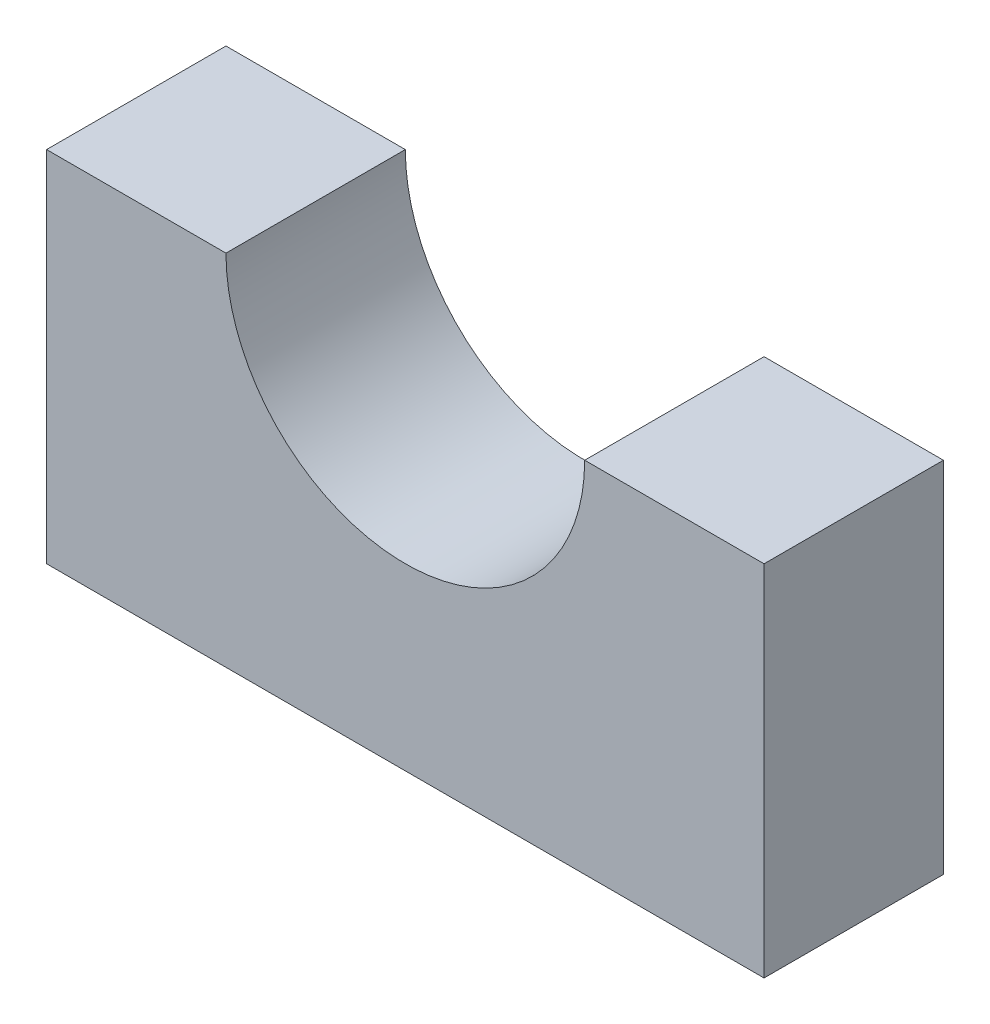
ISO-10303-21;
HEADER;
FILE_DESCRIPTION(('STEP AP214'),'2;1');
FILE_NAME('part.step','',(''),(''),'','','');
FILE_SCHEMA(('AUTOMOTIVE_DESIGN { 1 0 10303 214 1 1 1 1 }'));
ENDSEC;
DATA;
#1=APPLICATION_CONTEXT('core data for automotive mechanical design processes');
#2=APPLICATION_PROTOCOL_DEFINITION('international standard','automotive_design',2000,#1);
#3=PRODUCT_CONTEXT('',#1,'mechanical');
#4=PRODUCT('Part','Part','',(#3));
#5=PRODUCT_RELATED_PRODUCT_CATEGORY('part','',(#4));
#6=PRODUCT_DEFINITION_FORMATION('','',#4);
#7=PRODUCT_DEFINITION_CONTEXT('part definition',#1,'design');
#8=PRODUCT_DEFINITION('design','',#6,#7);
#9=PRODUCT_DEFINITION_SHAPE('','',#8);
#10=(LENGTH_UNIT() NAMED_UNIT(*) SI_UNIT(.MILLI.,.METRE.));
#11=(NAMED_UNIT(*) PLANE_ANGLE_UNIT() SI_UNIT($,.RADIAN.));
#12=(NAMED_UNIT(*) SI_UNIT($,.STERADIAN.) SOLID_ANGLE_UNIT());
#13=UNCERTAINTY_MEASURE_WITH_UNIT(LENGTH_MEASURE(1.E-05),#10,'distance_accuracy_value','');
#14=(GEOMETRIC_REPRESENTATION_CONTEXT(3) GLOBAL_UNCERTAINTY_ASSIGNED_CONTEXT((#13)) GLOBAL_UNIT_ASSIGNED_CONTEXT((#10,
#11,#12)) REPRESENTATION_CONTEXT('',''));
#15=CARTESIAN_POINT('',(0.,0.,0.));
#16=DIRECTION('',(0.,0.,1.));
#17=DIRECTION('',(1.,0.,0.));
#18=AXIS2_PLACEMENT_3D('',#15,#16,#17);
#19=CARTESIAN_POINT('',(0.,0.,35.));
#20=DIRECTION('',(1.,0.,0.));
#21=DIRECTION('',(0.,0.,-1.));
#22=AXIS2_PLACEMENT_3D('',#19,#20,#21);
#23=PLANE('',#22);
#24=DIRECTION('',(0.,-1.,0.));
#25=VECTOR('',#24,1.);
#26=CARTESIAN_POINT('',(0.,0.,0.));
#27=LINE('',#26,#25);
#28=CARTESIAN_POINT('',(0.,70.,0.));
#29=VERTEX_POINT('',#28);
#30=CARTESIAN_POINT('',(0.,0.,0.));
#31=VERTEX_POINT('',#30);
#32=EDGE_CURVE('E119',#29,#31,#27,.T.);
#33=ORIENTED_EDGE('',*,*,#32,.T.);
#34=DIRECTION('',(0.,0.,-1.));
#35=VECTOR('',#34,1.);
#36=CARTESIAN_POINT('',(0.,0.,35.));
#37=LINE('',#36,#35);
#38=CARTESIAN_POINT('',(0.,0.,35.));
#39=VERTEX_POINT('',#38);
#40=EDGE_CURVE('E11',#39,#31,#37,.T.);
#41=ORIENTED_EDGE('',*,*,#40,.F.);
#42=DIRECTION('',(0.,-1.,0.));
#43=VECTOR('',#42,1.);
#44=CARTESIAN_POINT('',(0.,0.,35.));
#45=LINE('',#44,#43);
#46=CARTESIAN_POINT('',(0.,70.,35.));
#47=VERTEX_POINT('',#46);
#48=EDGE_CURVE('E129',#47,#39,#45,.T.);
#49=ORIENTED_EDGE('',*,*,#48,.F.);
#50=DIRECTION('',(0.,0.,-1.));
#51=VECTOR('',#50,1.);
#52=CARTESIAN_POINT('',(0.,70.,35.));
#53=LINE('',#52,#51);
#54=EDGE_CURVE('E115',#47,#29,#53,.T.);
#55=ORIENTED_EDGE('',*,*,#54,.T.);
#56=EDGE_LOOP('',(#33,#41,#49,#55));
#57=FACE_BOUND('',#56,.T.);
#58=ADVANCED_FACE('F35',(#57),#23,.F.);
#59=CARTESIAN_POINT('',(0.,0.,35.));
#60=DIRECTION('',(0.,1.,0.));
#61=DIRECTION('',(0.,0.,1.));
#62=AXIS2_PLACEMENT_3D('',#59,#60,#61);
#63=PLANE('',#62);
#64=DIRECTION('',(1.,0.,0.));
#65=VECTOR('',#64,1.);
#66=CARTESIAN_POINT('',(0.,0.,0.));
#67=LINE('',#66,#65);
#68=CARTESIAN_POINT('',(140.,0.,0.));
#69=VERTEX_POINT('',#68);
#70=EDGE_CURVE('E122',#31,#69,#67,.T.);
#71=ORIENTED_EDGE('',*,*,#70,.T.);
#72=DIRECTION('',(0.,0.,-1.));
#73=VECTOR('',#72,1.);
#74=CARTESIAN_POINT('',(140.,0.,35.));
#75=LINE('',#74,#73);
#76=CARTESIAN_POINT('',(140.,0.,35.));
#77=VERTEX_POINT('',#76);
#78=EDGE_CURVE('E43',#77,#69,#75,.T.);
#79=ORIENTED_EDGE('',*,*,#78,.F.);
#80=DIRECTION('',(1.,0.,0.));
#81=VECTOR('',#80,1.);
#82=CARTESIAN_POINT('',(0.,0.,35.));
#83=LINE('',#82,#81);
#84=EDGE_CURVE('E88',#39,#77,#83,.T.);
#85=ORIENTED_EDGE('',*,*,#84,.F.);
#86=ORIENTED_EDGE('',*,*,#40,.T.);
#87=EDGE_LOOP('',(#71,#79,#85,#86));
#88=FACE_BOUND('',#87,.T.);
#89=ADVANCED_FACE('F153',(#88),#63,.F.);
#90=CARTESIAN_POINT('',(140.,0.,35.));
#91=DIRECTION('',(-1.,0.,0.));
#92=DIRECTION('',(0.,0.,1.));
#93=AXIS2_PLACEMENT_3D('',#90,#91,#92);
#94=PLANE('',#93);
#95=DIRECTION('',(0.,1.,0.));
#96=VECTOR('',#95,1.);
#97=CARTESIAN_POINT('',(140.,0.,0.));
#98=LINE('',#97,#96);
#99=CARTESIAN_POINT('',(140.,70.,0.));
#100=VERTEX_POINT('',#99);
#101=EDGE_CURVE('E124',#69,#100,#98,.T.);
#102=ORIENTED_EDGE('',*,*,#101,.T.);
#103=DIRECTION('',(0.,0.,-1.));
#104=VECTOR('',#103,1.);
#105=CARTESIAN_POINT('',(140.,70.,35.));
#106=LINE('',#105,#104);
#107=CARTESIAN_POINT('',(140.,70.,35.));
#108=VERTEX_POINT('',#107);
#109=EDGE_CURVE('E110',#108,#100,#106,.T.);
#110=ORIENTED_EDGE('',*,*,#109,.F.);
#111=DIRECTION('',(0.,1.,0.));
#112=VECTOR('',#111,1.);
#113=CARTESIAN_POINT('',(140.,0.,35.));
#114=LINE('',#113,#112);
#115=EDGE_CURVE('E101',#77,#108,#114,.T.);
#116=ORIENTED_EDGE('',*,*,#115,.F.);
#117=ORIENTED_EDGE('',*,*,#78,.T.);
#118=EDGE_LOOP('',(#102,#110,#116,#117));
#119=FACE_BOUND('',#118,.T.);
#120=ADVANCED_FACE('F135',(#119),#94,.F.);
#121=CARTESIAN_POINT('',(105.,70.,35.));
#122=DIRECTION('',(0.,-1.,0.));
#123=DIRECTION('',(0.,0.,-1.));
#124=AXIS2_PLACEMENT_3D('',#121,#122,#123);
#125=PLANE('',#124);
#126=DIRECTION('',(-1.,0.,0.));
#127=VECTOR('',#126,1.);
#128=CARTESIAN_POINT('',(105.,70.,0.));
#129=LINE('',#128,#127);
#130=CARTESIAN_POINT('',(105.,70.,0.));
#131=VERTEX_POINT('',#130);
#132=EDGE_CURVE('E109',#100,#131,#129,.T.);
#133=ORIENTED_EDGE('',*,*,#132,.T.);
#134=DIRECTION('',(0.,0.,-1.));
#135=VECTOR('',#134,1.);
#136=CARTESIAN_POINT('',(105.,70.,35.));
#137=LINE('',#136,#135);
#138=CARTESIAN_POINT('',(105.,70.,35.));
#139=VERTEX_POINT('',#138);
#140=EDGE_CURVE('E106',#139,#131,#137,.T.);
#141=ORIENTED_EDGE('',*,*,#140,.F.);
#142=DIRECTION('',(-1.,0.,0.));
#143=VECTOR('',#142,1.);
#144=CARTESIAN_POINT('',(105.,70.,35.));
#145=LINE('',#144,#143);
#146=EDGE_CURVE('E95',#108,#139,#145,.T.);
#147=ORIENTED_EDGE('',*,*,#146,.F.);
#148=ORIENTED_EDGE('',*,*,#109,.T.);
#149=EDGE_LOOP('',(#133,#141,#147,#148));
#150=FACE_BOUND('',#149,.T.);
#151=ADVANCED_FACE('F107',(#150),#125,.F.);
#152=CARTESIAN_POINT('',(70.,70.,35.));
#153=DIRECTION('',(0.,0.,-1.));
#154=DIRECTION('',(-1.,0.,0.));
#155=AXIS2_PLACEMENT_3D('',#152,#153,#154);
#156=CYLINDRICAL_SURFACE('',#155,35.);
#157=CARTESIAN_POINT('',(70.,70.,0.));
#158=DIRECTION('',(0.,0.,-1.));
#159=DIRECTION('',(-1.,0.,0.));
#160=AXIS2_PLACEMENT_3D('',#157,#158,#159);
#161=CIRCLE('',#160,35.);
#162=CARTESIAN_POINT('',(35.,70.,0.));
#163=VERTEX_POINT('',#162);
#164=EDGE_CURVE('E74',#131,#163,#161,.T.);
#165=ORIENTED_EDGE('',*,*,#164,.T.);
#166=DIRECTION('',(0.,0.,-1.));
#167=VECTOR('',#166,1.);
#168=CARTESIAN_POINT('',(35.,70.,35.));
#169=LINE('',#168,#167);
#170=CARTESIAN_POINT('',(35.,70.,35.));
#171=VERTEX_POINT('',#170);
#172=EDGE_CURVE('E111',#171,#163,#169,.T.);
#173=ORIENTED_EDGE('',*,*,#172,.F.);
#174=CARTESIAN_POINT('',(70.,70.,35.));
#175=DIRECTION('',(0.,0.,-1.));
#176=DIRECTION('',(-1.,0.,0.));
#177=AXIS2_PLACEMENT_3D('',#174,#175,#176);
#178=CIRCLE('',#177,35.);
#179=EDGE_CURVE('E99',#139,#171,#178,.T.);
#180=ORIENTED_EDGE('',*,*,#179,.F.);
#181=ORIENTED_EDGE('',*,*,#140,.T.);
#182=EDGE_LOOP('',(#165,#173,#180,#181));
#183=FACE_BOUND('',#182,.T.);
#184=ADVANCED_FACE('F113',(#183),#156,.F.);
#185=CARTESIAN_POINT('',(0.,70.,35.));
#186=DIRECTION('',(0.,-1.,0.));
#187=DIRECTION('',(0.,0.,-1.));
#188=AXIS2_PLACEMENT_3D('',#185,#186,#187);
#189=PLANE('',#188);
#190=DIRECTION('',(-1.,0.,0.));
#191=VECTOR('',#190,1.);
#192=CARTESIAN_POINT('',(0.,70.,0.));
#193=LINE('',#192,#191);
#194=EDGE_CURVE('E80',#163,#29,#193,.T.);
#195=ORIENTED_EDGE('',*,*,#194,.T.);
#196=ORIENTED_EDGE('',*,*,#54,.F.);
#197=DIRECTION('',(-1.,0.,0.));
#198=VECTOR('',#197,1.);
#199=CARTESIAN_POINT('',(0.,70.,35.));
#200=LINE('',#199,#198);
#201=EDGE_CURVE('E51',#171,#47,#200,.T.);
#202=ORIENTED_EDGE('',*,*,#201,.F.);
#203=ORIENTED_EDGE('',*,*,#172,.T.);
#204=EDGE_LOOP('',(#195,#196,#202,#203));
#205=FACE_BOUND('',#204,.T.);
#206=ADVANCED_FACE('F142',(#205),#189,.F.);
#207=CARTESIAN_POINT('',(70.,70.,35.));
#208=DIRECTION('',(0.,0.,-1.));
#209=DIRECTION('',(-1.,0.,0.));
#210=AXIS2_PLACEMENT_3D('',#207,#208,#209);
#211=PLANE('',#210);
#212=ORIENTED_EDGE('',*,*,#48,.T.);
#213=ORIENTED_EDGE('',*,*,#84,.T.);
#214=ORIENTED_EDGE('',*,*,#115,.T.);
#215=ORIENTED_EDGE('',*,*,#146,.T.);
#216=ORIENTED_EDGE('',*,*,#179,.T.);
#217=ORIENTED_EDGE('',*,*,#201,.T.);
#218=EDGE_LOOP('',(#212,#213,#214,#215,#216,#217));
#219=FACE_BOUND('',#218,.T.);
#220=ADVANCED_FACE('F97',(#219),#211,.F.);
#221=CARTESIAN_POINT('',(70.,70.,0.));
#222=DIRECTION('',(0.,0.,-1.));
#223=DIRECTION('',(-1.,0.,0.));
#224=AXIS2_PLACEMENT_3D('',#221,#222,#223);
#225=PLANE('',#224);
#226=ORIENTED_EDGE('',*,*,#32,.F.);
#227=ORIENTED_EDGE('',*,*,#194,.F.);
#228=ORIENTED_EDGE('',*,*,#164,.F.);
#229=ORIENTED_EDGE('',*,*,#132,.F.);
#230=ORIENTED_EDGE('',*,*,#101,.F.);
#231=ORIENTED_EDGE('',*,*,#70,.F.);
#232=EDGE_LOOP('',(#226,#227,#228,#229,#230,#231));
#233=FACE_BOUND('',#232,.T.);
#234=ADVANCED_FACE('F138',(#233),#225,.T.);
#235=CLOSED_SHELL('',(#58,#89,#120,#151,#184,#206,#220,#234));
#236=MANIFOLD_SOLID_BREP('B2',#235);
#237=ADVANCED_BREP_SHAPE_REPRESENTATION('',(#18,#236),#14);
#238=SHAPE_DEFINITION_REPRESENTATION(#9,#237);
ENDSEC;
END-ISO-10303-21;
